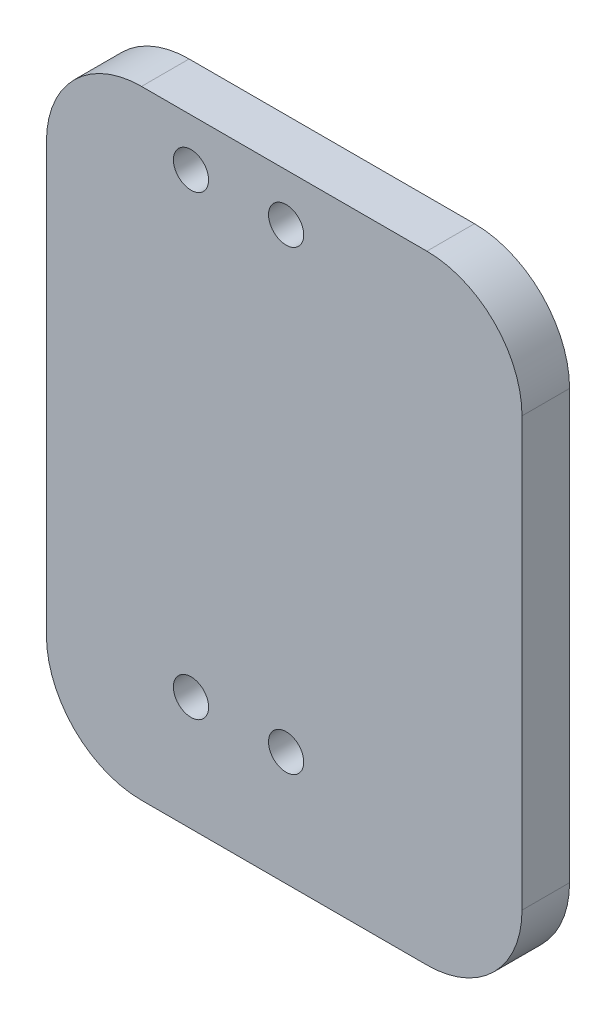
ISO-10303-21;
HEADER;
FILE_DESCRIPTION(('STEP AP214'),'2;1');
FILE_NAME('part.step','',(''),(''),'','','');
FILE_SCHEMA(('AUTOMOTIVE_DESIGN { 1 0 10303 214 1 1 1 1 }'));
ENDSEC;
DATA;
#1=APPLICATION_CONTEXT('core data for automotive mechanical design processes');
#2=APPLICATION_PROTOCOL_DEFINITION('international standard','automotive_design',2000,#1);
#3=PRODUCT_CONTEXT('',#1,'mechanical');
#4=PRODUCT('Part','Part','',(#3));
#5=PRODUCT_RELATED_PRODUCT_CATEGORY('part','',(#4));
#6=PRODUCT_DEFINITION_FORMATION('','',#4);
#7=PRODUCT_DEFINITION_CONTEXT('part definition',#1,'design');
#8=PRODUCT_DEFINITION('design','',#6,#7);
#9=PRODUCT_DEFINITION_SHAPE('','',#8);
#10=(LENGTH_UNIT() NAMED_UNIT(*) SI_UNIT(.MILLI.,.METRE.));
#11=(NAMED_UNIT(*) PLANE_ANGLE_UNIT() SI_UNIT($,.RADIAN.));
#12=(NAMED_UNIT(*) SI_UNIT($,.STERADIAN.) SOLID_ANGLE_UNIT());
#13=UNCERTAINTY_MEASURE_WITH_UNIT(LENGTH_MEASURE(1.E-05),#10,'distance_accuracy_value','');
#14=(GEOMETRIC_REPRESENTATION_CONTEXT(3) GLOBAL_UNCERTAINTY_ASSIGNED_CONTEXT((#13)) GLOBAL_UNIT_ASSIGNED_CONTEXT((#10,
#11,#12)) REPRESENTATION_CONTEXT('',''));
#15=CARTESIAN_POINT('',(0.,0.,0.));
#16=DIRECTION('',(0.,0.,1.));
#17=DIRECTION('',(1.,0.,0.));
#18=AXIS2_PLACEMENT_3D('',#15,#16,#17);
#19=CARTESIAN_POINT('',(25.,32.5,5.));
#20=DIRECTION('',(-1.,0.,0.));
#21=DIRECTION('',(0.,-1.,0.));
#22=AXIS2_PLACEMENT_3D('',#19,#20,#21);
#23=PLANE('',#22);
#24=DIRECTION('',(0.,1.,0.));
#25=VECTOR('',#24,1.);
#26=CARTESIAN_POINT('',(25.,32.5,0.));
#27=LINE('',#26,#25);
#28=CARTESIAN_POINT('',(25.,-22.5,0.));
#29=VERTEX_POINT('',#28);
#30=CARTESIAN_POINT('',(25.,22.5,0.));
#31=VERTEX_POINT('',#30);
#32=EDGE_CURVE('E127',#29,#31,#27,.T.);
#33=ORIENTED_EDGE('',*,*,#32,.T.);
#34=DIRECTION('',(0.,0.,-1.));
#35=VECTOR('',#34,1.);
#36=CARTESIAN_POINT('',(25.,22.5,5.));
#37=LINE('',#36,#35);
#38=CARTESIAN_POINT('',(25.,22.5,5.));
#39=VERTEX_POINT('',#38);
#40=EDGE_CURVE('E105',#31,#39,#37,.F.);
#41=ORIENTED_EDGE('',*,*,#40,.T.);
#42=DIRECTION('',(0.,1.,0.));
#43=VECTOR('',#42,1.);
#44=CARTESIAN_POINT('',(25.,32.5,5.));
#45=LINE('',#44,#43);
#46=CARTESIAN_POINT('',(25.,-22.5,5.));
#47=VERTEX_POINT('',#46);
#48=EDGE_CURVE('E137',#47,#39,#45,.T.);
#49=ORIENTED_EDGE('',*,*,#48,.F.);
#50=DIRECTION('',(0.,0.,-1.));
#51=VECTOR('',#50,1.);
#52=CARTESIAN_POINT('',(25.,-22.5,5.));
#53=LINE('',#52,#51);
#54=EDGE_CURVE('E110',#47,#29,#53,.T.);
#55=ORIENTED_EDGE('',*,*,#54,.T.);
#56=EDGE_LOOP('',(#33,#41,#49,#55));
#57=FACE_BOUND('',#56,.T.);
#58=ADVANCED_FACE('F35',(#57),#23,.F.);
#59=CARTESIAN_POINT('',(-25.,32.5,5.));
#60=DIRECTION('',(0.,-1.,0.));
#61=DIRECTION('',(0.,0.,-1.));
#62=AXIS2_PLACEMENT_3D('',#59,#60,#61);
#63=PLANE('',#62);
#64=DIRECTION('',(-1.,0.,0.));
#65=VECTOR('',#64,1.);
#66=CARTESIAN_POINT('',(-25.,32.5,5.));
#67=LINE('',#66,#65);
#68=CARTESIAN_POINT('',(15.,32.5,5.));
#69=VERTEX_POINT('',#68);
#70=CARTESIAN_POINT('',(-15.,32.5,5.));
#71=VERTEX_POINT('',#70);
#72=EDGE_CURVE('E120',#69,#71,#67,.T.);
#73=ORIENTED_EDGE('',*,*,#72,.F.);
#74=DIRECTION('',(0.,0.,-1.));
#75=VECTOR('',#74,1.);
#76=CARTESIAN_POINT('',(15.,32.5,5.));
#77=LINE('',#76,#75);
#78=CARTESIAN_POINT('',(15.,32.5,0.));
#79=VERTEX_POINT('',#78);
#80=EDGE_CURVE('E104',#69,#79,#77,.T.);
#81=ORIENTED_EDGE('',*,*,#80,.T.);
#82=DIRECTION('',(-1.,0.,0.));
#83=VECTOR('',#82,1.);
#84=CARTESIAN_POINT('',(-25.,32.5,0.));
#85=LINE('',#84,#83);
#86=CARTESIAN_POINT('',(-15.,32.5,0.));
#87=VERTEX_POINT('',#86);
#88=EDGE_CURVE('E117',#79,#87,#85,.T.);
#89=ORIENTED_EDGE('',*,*,#88,.T.);
#90=DIRECTION('',(0.,0.,-1.));
#91=VECTOR('',#90,1.);
#92=CARTESIAN_POINT('',(-15.,32.5,5.));
#93=LINE('',#92,#91);
#94=EDGE_CURVE('E122',#87,#71,#93,.F.);
#95=ORIENTED_EDGE('',*,*,#94,.T.);
#96=EDGE_LOOP('',(#73,#81,#89,#95));
#97=FACE_BOUND('',#96,.T.);
#98=ADVANCED_FACE('F116',(#97),#63,.F.);
#99=CARTESIAN_POINT('',(-25.,32.5,5.));
#100=DIRECTION('',(1.,0.,0.));
#101=DIRECTION('',(0.,1.,0.));
#102=AXIS2_PLACEMENT_3D('',#99,#100,#101);
#103=PLANE('',#102);
#104=DIRECTION('',(0.,-1.,0.));
#105=VECTOR('',#104,1.);
#106=CARTESIAN_POINT('',(-25.,32.5,5.));
#107=LINE('',#106,#105);
#108=CARTESIAN_POINT('',(-25.,22.5,5.));
#109=VERTEX_POINT('',#108);
#110=CARTESIAN_POINT('',(-25.,-22.5,5.));
#111=VERTEX_POINT('',#110);
#112=EDGE_CURVE('E171',#109,#111,#107,.T.);
#113=ORIENTED_EDGE('',*,*,#112,.F.);
#114=DIRECTION('',(0.,0.,-1.));
#115=VECTOR('',#114,1.);
#116=CARTESIAN_POINT('',(-25.,22.5,5.));
#117=LINE('',#116,#115);
#118=CARTESIAN_POINT('',(-25.,22.5,0.));
#119=VERTEX_POINT('',#118);
#120=EDGE_CURVE('E156',#109,#119,#117,.T.);
#121=ORIENTED_EDGE('',*,*,#120,.T.);
#122=DIRECTION('',(0.,-1.,0.));
#123=VECTOR('',#122,1.);
#124=CARTESIAN_POINT('',(-25.,32.5,0.));
#125=LINE('',#124,#123);
#126=CARTESIAN_POINT('',(-25.,-22.5,0.));
#127=VERTEX_POINT('',#126);
#128=EDGE_CURVE('E126',#119,#127,#125,.T.);
#129=ORIENTED_EDGE('',*,*,#128,.T.);
#130=DIRECTION('',(0.,0.,-1.));
#131=VECTOR('',#130,1.);
#132=CARTESIAN_POINT('',(-25.,-22.5,5.));
#133=LINE('',#132,#131);
#134=EDGE_CURVE('E154',#127,#111,#133,.F.);
#135=ORIENTED_EDGE('',*,*,#134,.T.);
#136=EDGE_LOOP('',(#113,#121,#129,#135));
#137=FACE_BOUND('',#136,.T.);
#138=ADVANCED_FACE('F188',(#137),#103,.F.);
#139=CARTESIAN_POINT('',(-25.,-32.5,5.));
#140=DIRECTION('',(0.,1.,0.));
#141=DIRECTION('',(0.,0.,1.));
#142=AXIS2_PLACEMENT_3D('',#139,#140,#141);
#143=PLANE('',#142);
#144=DIRECTION('',(1.,0.,0.));
#145=VECTOR('',#144,1.);
#146=CARTESIAN_POINT('',(-25.,-32.5,0.));
#147=LINE('',#146,#145);
#148=CARTESIAN_POINT('',(-15.,-32.5,0.));
#149=VERTEX_POINT('',#148);
#150=CARTESIAN_POINT('',(15.,-32.5,0.));
#151=VERTEX_POINT('',#150);
#152=EDGE_CURVE('E130',#149,#151,#147,.T.);
#153=ORIENTED_EDGE('',*,*,#152,.T.);
#154=DIRECTION('',(0.,0.,-1.));
#155=VECTOR('',#154,1.);
#156=CARTESIAN_POINT('',(15.,-32.5,5.));
#157=LINE('',#156,#155);
#158=CARTESIAN_POINT('',(15.,-32.5,5.));
#159=VERTEX_POINT('',#158);
#160=EDGE_CURVE('E11',#151,#159,#157,.F.);
#161=ORIENTED_EDGE('',*,*,#160,.T.);
#162=DIRECTION('',(1.,0.,0.));
#163=VECTOR('',#162,1.);
#164=CARTESIAN_POINT('',(-25.,-32.5,5.));
#165=LINE('',#164,#163);
#166=CARTESIAN_POINT('',(-15.,-32.5,5.));
#167=VERTEX_POINT('',#166);
#168=EDGE_CURVE('E138',#167,#159,#165,.T.);
#169=ORIENTED_EDGE('',*,*,#168,.F.);
#170=DIRECTION('',(0.,0.,-1.));
#171=VECTOR('',#170,1.);
#172=CARTESIAN_POINT('',(-15.,-32.5,5.));
#173=LINE('',#172,#171);
#174=EDGE_CURVE('E43',#167,#149,#173,.T.);
#175=ORIENTED_EDGE('',*,*,#174,.T.);
#176=EDGE_LOOP('',(#153,#161,#169,#175));
#177=FACE_BOUND('',#176,.T.);
#178=ADVANCED_FACE('F161',(#177),#143,.F.);
#179=CARTESIAN_POINT('',(0.,0.,5.));
#180=DIRECTION('',(0.,0.,1.));
#181=DIRECTION('',(1.,0.,0.));
#182=AXIS2_PLACEMENT_3D('',#179,#180,#181);
#183=PLANE('',#182);
#184=CARTESIAN_POINT('',(0.200000000000029,-20.5000000000001,5.));
#185=DIRECTION('',(0.,0.,1.));
#186=DIRECTION('',(1.,0.,0.));
#187=AXIS2_PLACEMENT_3D('',#184,#185,#186);
#188=CIRCLE('',#187,1.85);
#189=CARTESIAN_POINT('',(2.05000000000003,-20.5000000000001,5.));
#190=VERTEX_POINT('',#189);
#191=EDGE_CURVE('E306',#190,#190,#188,.T.);
#192=ORIENTED_EDGE('',*,*,#191,.F.);
#193=EDGE_LOOP('',(#192));
#194=FACE_BOUND('',#193,.T.);
#195=CARTESIAN_POINT('',(-9.79999999999997,27.4999999999999,5.));
#196=DIRECTION('',(0.,0.,1.));
#197=DIRECTION('',(1.,0.,0.));
#198=AXIS2_PLACEMENT_3D('',#195,#196,#197);
#199=CIRCLE('',#198,1.85);
#200=CARTESIAN_POINT('',(-7.94999999999997,27.4999999999999,5.));
#201=VERTEX_POINT('',#200);
#202=EDGE_CURVE('E318',#201,#201,#199,.T.);
#203=ORIENTED_EDGE('',*,*,#202,.F.);
#204=EDGE_LOOP('',(#203));
#205=FACE_BOUND('',#204,.T.);
#206=CARTESIAN_POINT('',(0.200000000000029,27.4999999999999,5.));
#207=DIRECTION('',(0.,0.,1.));
#208=DIRECTION('',(1.,0.,0.));
#209=AXIS2_PLACEMENT_3D('',#206,#207,#208);
#210=CIRCLE('',#209,1.85);
#211=CARTESIAN_POINT('',(2.05000000000003,27.4999999999999,5.));
#212=VERTEX_POINT('',#211);
#213=EDGE_CURVE('E313',#212,#212,#210,.T.);
#214=ORIENTED_EDGE('',*,*,#213,.F.);
#215=EDGE_LOOP('',(#214));
#216=FACE_BOUND('',#215,.T.);
#217=CARTESIAN_POINT('',(-9.79999999999997,-20.5000000000001,5.));
#218=DIRECTION('',(0.,0.,1.));
#219=DIRECTION('',(1.,0.,0.));
#220=AXIS2_PLACEMENT_3D('',#217,#218,#219);
#221=CIRCLE('',#220,1.85);
#222=CARTESIAN_POINT('',(-7.94999999999996,-20.5000000000001,5.));
#223=VERTEX_POINT('',#222);
#224=EDGE_CURVE('E174',#223,#223,#221,.T.);
#225=ORIENTED_EDGE('',*,*,#224,.F.);
#226=EDGE_LOOP('',(#225));
#227=FACE_BOUND('',#226,.T.);
#228=ORIENTED_EDGE('',*,*,#48,.T.);
#229=CARTESIAN_POINT('',(15.,22.5,5.));
#230=DIRECTION('',(0.,0.,1.));
#231=DIRECTION('',(1.,0.,0.));
#232=AXIS2_PLACEMENT_3D('',#229,#230,#231);
#233=CIRCLE('',#232,10.);
#234=EDGE_CURVE('E152',#39,#69,#233,.T.);
#235=ORIENTED_EDGE('',*,*,#234,.T.);
#236=ORIENTED_EDGE('',*,*,#72,.T.);
#237=CARTESIAN_POINT('',(-15.,22.5,5.));
#238=DIRECTION('',(0.,0.,1.));
#239=DIRECTION('',(1.,0.,0.));
#240=AXIS2_PLACEMENT_3D('',#237,#238,#239);
#241=CIRCLE('',#240,10.);
#242=EDGE_CURVE('E150',#71,#109,#241,.T.);
#243=ORIENTED_EDGE('',*,*,#242,.T.);
#244=ORIENTED_EDGE('',*,*,#112,.T.);
#245=CARTESIAN_POINT('',(-15.,-22.5,5.));
#246=DIRECTION('',(0.,0.,1.));
#247=DIRECTION('',(1.,0.,0.));
#248=AXIS2_PLACEMENT_3D('',#245,#246,#247);
#249=CIRCLE('',#248,10.);
#250=EDGE_CURVE('E55',#111,#167,#249,.T.);
#251=ORIENTED_EDGE('',*,*,#250,.T.);
#252=ORIENTED_EDGE('',*,*,#168,.T.);
#253=CARTESIAN_POINT('',(15.,-22.5,5.));
#254=DIRECTION('',(0.,0.,1.));
#255=DIRECTION('',(1.,0.,0.));
#256=AXIS2_PLACEMENT_3D('',#253,#254,#255);
#257=CIRCLE('',#256,10.);
#258=EDGE_CURVE('E148',#159,#47,#257,.T.);
#259=ORIENTED_EDGE('',*,*,#258,.T.);
#260=EDGE_LOOP('',(#228,#235,#236,#243,#244,#251,#252,#259));
#261=FACE_BOUND('',#260,.T.);
#262=ADVANCED_FACE('F177',(#194,#205,#216,#227,#261),#183,.T.);
#263=CARTESIAN_POINT('',(0.,0.,0.));
#264=DIRECTION('',(0.,0.,1.));
#265=DIRECTION('',(1.,0.,0.));
#266=AXIS2_PLACEMENT_3D('',#263,#264,#265);
#267=PLANE('',#266);
#268=CARTESIAN_POINT('',(0.200000000000029,-20.5000000000001,0.));
#269=DIRECTION('',(0.,0.,1.));
#270=DIRECTION('',(1.,0.,0.));
#271=AXIS2_PLACEMENT_3D('',#268,#269,#270);
#272=CIRCLE('',#271,1.85);
#273=CARTESIAN_POINT('',(2.05000000000003,-20.5000000000001,0.));
#274=VERTEX_POINT('',#273);
#275=EDGE_CURVE('E304',#274,#274,#272,.T.);
#276=ORIENTED_EDGE('',*,*,#275,.T.);
#277=EDGE_LOOP('',(#276));
#278=FACE_BOUND('',#277,.T.);
#279=CARTESIAN_POINT('',(-9.79999999999997,27.4999999999999,0.));
#280=DIRECTION('',(0.,0.,1.));
#281=DIRECTION('',(1.,0.,0.));
#282=AXIS2_PLACEMENT_3D('',#279,#280,#281);
#283=CIRCLE('',#282,1.85);
#284=CARTESIAN_POINT('',(-7.94999999999997,27.4999999999999,0.));
#285=VERTEX_POINT('',#284);
#286=EDGE_CURVE('E310',#285,#285,#283,.T.);
#287=ORIENTED_EDGE('',*,*,#286,.T.);
#288=EDGE_LOOP('',(#287));
#289=FACE_BOUND('',#288,.T.);
#290=CARTESIAN_POINT('',(0.200000000000029,27.4999999999999,0.));
#291=DIRECTION('',(0.,0.,1.));
#292=DIRECTION('',(1.,0.,0.));
#293=AXIS2_PLACEMENT_3D('',#290,#291,#292);
#294=CIRCLE('',#293,1.85);
#295=CARTESIAN_POINT('',(2.05000000000003,27.4999999999999,0.));
#296=VERTEX_POINT('',#295);
#297=EDGE_CURVE('E320',#296,#296,#294,.T.);
#298=ORIENTED_EDGE('',*,*,#297,.T.);
#299=EDGE_LOOP('',(#298));
#300=FACE_BOUND('',#299,.T.);
#301=CARTESIAN_POINT('',(-9.79999999999997,-20.5000000000001,0.));
#302=DIRECTION('',(0.,0.,1.));
#303=DIRECTION('',(1.,0.,0.));
#304=AXIS2_PLACEMENT_3D('',#301,#302,#303);
#305=CIRCLE('',#304,1.85);
#306=CARTESIAN_POINT('',(-7.94999999999996,-20.5000000000001,0.));
#307=VERTEX_POINT('',#306);
#308=EDGE_CURVE('E132',#307,#307,#305,.T.);
#309=ORIENTED_EDGE('',*,*,#308,.T.);
#310=EDGE_LOOP('',(#309));
#311=FACE_BOUND('',#310,.T.);
#312=ORIENTED_EDGE('',*,*,#88,.F.);
#313=CARTESIAN_POINT('',(15.,22.5,0.));
#314=DIRECTION('',(0.,0.,1.));
#315=DIRECTION('',(1.,0.,0.));
#316=AXIS2_PLACEMENT_3D('',#313,#314,#315);
#317=CIRCLE('',#316,10.);
#318=EDGE_CURVE('E100',#79,#31,#317,.F.);
#319=ORIENTED_EDGE('',*,*,#318,.T.);
#320=ORIENTED_EDGE('',*,*,#32,.F.);
#321=CARTESIAN_POINT('',(15.,-22.5,0.));
#322=DIRECTION('',(0.,0.,1.));
#323=DIRECTION('',(1.,0.,0.));
#324=AXIS2_PLACEMENT_3D('',#321,#322,#323);
#325=CIRCLE('',#324,10.);
#326=EDGE_CURVE('E141',#29,#151,#325,.F.);
#327=ORIENTED_EDGE('',*,*,#326,.T.);
#328=ORIENTED_EDGE('',*,*,#152,.F.);
#329=CARTESIAN_POINT('',(-15.,-22.5,0.));
#330=DIRECTION('',(0.,0.,1.));
#331=DIRECTION('',(1.,0.,0.));
#332=AXIS2_PLACEMENT_3D('',#329,#330,#331);
#333=CIRCLE('',#332,10.);
#334=EDGE_CURVE('E121',#149,#127,#333,.F.);
#335=ORIENTED_EDGE('',*,*,#334,.T.);
#336=ORIENTED_EDGE('',*,*,#128,.F.);
#337=CARTESIAN_POINT('',(-15.,22.5,0.));
#338=DIRECTION('',(0.,0.,1.));
#339=DIRECTION('',(1.,0.,0.));
#340=AXIS2_PLACEMENT_3D('',#337,#338,#339);
#341=CIRCLE('',#340,10.);
#342=EDGE_CURVE('E111',#119,#87,#341,.F.);
#343=ORIENTED_EDGE('',*,*,#342,.T.);
#344=EDGE_LOOP('',(#312,#319,#320,#327,#328,#335,#336,#343));
#345=FACE_BOUND('',#344,.T.);
#346=ADVANCED_FACE('F124',(#278,#289,#300,#311,#345),#267,.F.);
#347=CARTESIAN_POINT('',(-9.79999999999997,-20.5000000000001,0.));
#348=DIRECTION('',(0.,0.,1.));
#349=DIRECTION('',(1.,0.,0.));
#350=AXIS2_PLACEMENT_3D('',#347,#348,#349);
#351=CYLINDRICAL_SURFACE('',#350,1.85);
#352=ORIENTED_EDGE('',*,*,#308,.F.);
#353=EDGE_LOOP('',(#352));
#354=FACE_BOUND('',#353,.T.);
#355=ORIENTED_EDGE('',*,*,#224,.T.);
#356=EDGE_LOOP('',(#355));
#357=FACE_BOUND('',#356,.T.);
#358=ADVANCED_FACE('F185',(#354,#357),#351,.F.);
#359=CARTESIAN_POINT('',(0.200000000000029,27.4999999999999,0.));
#360=DIRECTION('',(0.,0.,1.));
#361=DIRECTION('',(1.,0.,0.));
#362=AXIS2_PLACEMENT_3D('',#359,#360,#361);
#363=CYLINDRICAL_SURFACE('',#362,1.85);
#364=ORIENTED_EDGE('',*,*,#297,.F.);
#365=EDGE_LOOP('',(#364));
#366=FACE_BOUND('',#365,.T.);
#367=ORIENTED_EDGE('',*,*,#213,.T.);
#368=EDGE_LOOP('',(#367));
#369=FACE_BOUND('',#368,.T.);
#370=ADVANCED_FACE('F275',(#366,#369),#363,.F.);
#371=CARTESIAN_POINT('',(-9.79999999999997,27.4999999999999,0.));
#372=DIRECTION('',(0.,0.,1.));
#373=DIRECTION('',(1.,0.,0.));
#374=AXIS2_PLACEMENT_3D('',#371,#372,#373);
#375=CYLINDRICAL_SURFACE('',#374,1.85);
#376=ORIENTED_EDGE('',*,*,#286,.F.);
#377=EDGE_LOOP('',(#376));
#378=FACE_BOUND('',#377,.T.);
#379=ORIENTED_EDGE('',*,*,#202,.T.);
#380=EDGE_LOOP('',(#379));
#381=FACE_BOUND('',#380,.T.);
#382=ADVANCED_FACE('F268',(#378,#381),#375,.F.);
#383=CARTESIAN_POINT('',(0.200000000000029,-20.5000000000001,0.));
#384=DIRECTION('',(0.,0.,1.));
#385=DIRECTION('',(1.,0.,0.));
#386=AXIS2_PLACEMENT_3D('',#383,#384,#385);
#387=CYLINDRICAL_SURFACE('',#386,1.85);
#388=ORIENTED_EDGE('',*,*,#275,.F.);
#389=EDGE_LOOP('',(#388));
#390=FACE_BOUND('',#389,.T.);
#391=ORIENTED_EDGE('',*,*,#191,.T.);
#392=EDGE_LOOP('',(#391));
#393=FACE_BOUND('',#392,.T.);
#394=ADVANCED_FACE('F204',(#390,#393),#387,.F.);
#395=CARTESIAN_POINT('',(15.,22.5,5.));
#396=DIRECTION('',(0.,0.,-1.));
#397=DIRECTION('',(-1.,0.,0.));
#398=AXIS2_PLACEMENT_3D('',#395,#396,#397);
#399=CYLINDRICAL_SURFACE('',#398,10.);
#400=ORIENTED_EDGE('',*,*,#234,.F.);
#401=ORIENTED_EDGE('',*,*,#40,.F.);
#402=ORIENTED_EDGE('',*,*,#318,.F.);
#403=ORIENTED_EDGE('',*,*,#80,.F.);
#404=EDGE_LOOP('',(#400,#401,#402,#403));
#405=FACE_BOUND('',#404,.T.);
#406=ADVANCED_FACE('F103',(#405),#399,.T.);
#407=CARTESIAN_POINT('',(-15.,22.5,5.));
#408=DIRECTION('',(0.,0.,-1.));
#409=DIRECTION('',(-1.,0.,0.));
#410=AXIS2_PLACEMENT_3D('',#407,#408,#409);
#411=CYLINDRICAL_SURFACE('',#410,10.);
#412=ORIENTED_EDGE('',*,*,#242,.F.);
#413=ORIENTED_EDGE('',*,*,#94,.F.);
#414=ORIENTED_EDGE('',*,*,#342,.F.);
#415=ORIENTED_EDGE('',*,*,#120,.F.);
#416=EDGE_LOOP('',(#412,#413,#414,#415));
#417=FACE_BOUND('',#416,.T.);
#418=ADVANCED_FACE('F203',(#417),#411,.T.);
#419=CARTESIAN_POINT('',(15.,-22.5,5.));
#420=DIRECTION('',(0.,0.,-1.));
#421=DIRECTION('',(-1.,0.,0.));
#422=AXIS2_PLACEMENT_3D('',#419,#420,#421);
#423=CYLINDRICAL_SURFACE('',#422,10.);
#424=ORIENTED_EDGE('',*,*,#258,.F.);
#425=ORIENTED_EDGE('',*,*,#160,.F.);
#426=ORIENTED_EDGE('',*,*,#326,.F.);
#427=ORIENTED_EDGE('',*,*,#54,.F.);
#428=EDGE_LOOP('',(#424,#425,#426,#427));
#429=FACE_BOUND('',#428,.T.);
#430=ADVANCED_FACE('F166',(#429),#423,.T.);
#431=CARTESIAN_POINT('',(-15.,-22.5,5.));
#432=DIRECTION('',(0.,0.,-1.));
#433=DIRECTION('',(-1.,0.,0.));
#434=AXIS2_PLACEMENT_3D('',#431,#432,#433);
#435=CYLINDRICAL_SURFACE('',#434,10.);
#436=ORIENTED_EDGE('',*,*,#250,.F.);
#437=ORIENTED_EDGE('',*,*,#134,.F.);
#438=ORIENTED_EDGE('',*,*,#334,.F.);
#439=ORIENTED_EDGE('',*,*,#174,.F.);
#440=EDGE_LOOP('',(#436,#437,#438,#439));
#441=FACE_BOUND('',#440,.T.);
#442=ADVANCED_FACE('F37',(#441),#435,.T.);
#443=CLOSED_SHELL('',(#58,#98,#138,#178,#262,#346,#358,#370,#382,#394,#406,#418,#430,#442));
#444=MANIFOLD_SOLID_BREP('B2',#443);
#445=ADVANCED_BREP_SHAPE_REPRESENTATION('',(#18,#444),#14);
#446=SHAPE_DEFINITION_REPRESENTATION(#9,#445);
ENDSEC;
END-ISO-10303-21;
